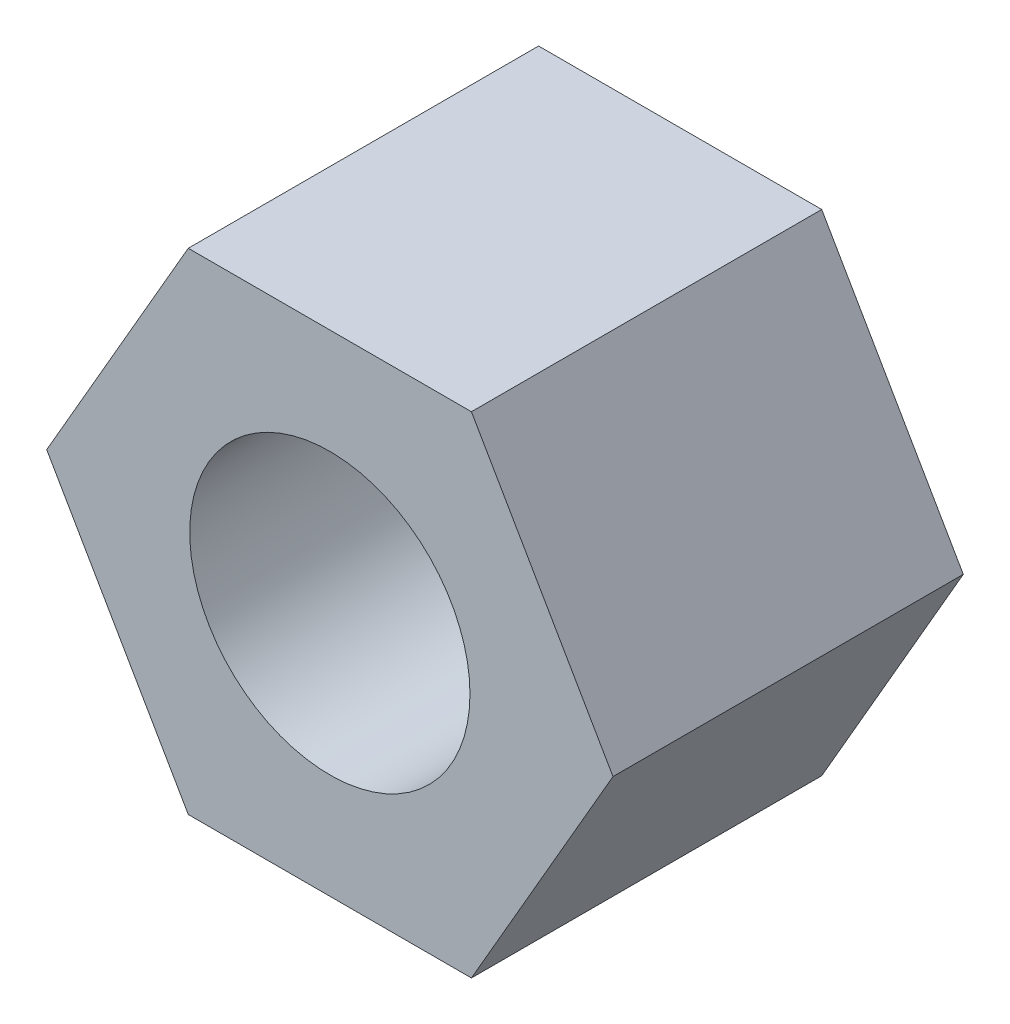
ISO-10303-21;
HEADER;
FILE_DESCRIPTION(('STEP AP214'),'2;1');
FILE_NAME('part.step','',(''),(''),'','','');
FILE_SCHEMA(('AUTOMOTIVE_DESIGN { 1 0 10303 214 1 1 1 1 }'));
ENDSEC;
DATA;
#1=APPLICATION_CONTEXT('core data for automotive mechanical design processes');
#2=APPLICATION_PROTOCOL_DEFINITION('international standard','automotive_design',2000,#1);
#3=PRODUCT_CONTEXT('',#1,'mechanical');
#4=PRODUCT('Part','Part','',(#3));
#5=PRODUCT_RELATED_PRODUCT_CATEGORY('part','',(#4));
#6=PRODUCT_DEFINITION_FORMATION('','',#4);
#7=PRODUCT_DEFINITION_CONTEXT('part definition',#1,'design');
#8=PRODUCT_DEFINITION('design','',#6,#7);
#9=PRODUCT_DEFINITION_SHAPE('','',#8);
#10=(LENGTH_UNIT() NAMED_UNIT(*) SI_UNIT(.MILLI.,.METRE.));
#11=(NAMED_UNIT(*) PLANE_ANGLE_UNIT() SI_UNIT($,.RADIAN.));
#12=(NAMED_UNIT(*) SI_UNIT($,.STERADIAN.) SOLID_ANGLE_UNIT());
#13=UNCERTAINTY_MEASURE_WITH_UNIT(LENGTH_MEASURE(1.E-05),#10,'distance_accuracy_value','');
#14=(GEOMETRIC_REPRESENTATION_CONTEXT(3) GLOBAL_UNCERTAINTY_ASSIGNED_CONTEXT((#13)) GLOBAL_UNIT_ASSIGNED_CONTEXT((#10,
#11,#12)) REPRESENTATION_CONTEXT('',''));
#15=CARTESIAN_POINT('',(0.,0.,0.));
#16=DIRECTION('',(0.,0.,1.));
#17=DIRECTION('',(1.,0.,0.));
#18=AXIS2_PLACEMENT_3D('',#15,#16,#17);
#19=CARTESIAN_POINT('',(-20.2072594216369,35.,50.));
#20=DIRECTION('',(0.866025403784439,-0.5,0.));
#21=DIRECTION('',(0.5,0.866025403784439,0.));
#22=AXIS2_PLACEMENT_3D('',#19,#20,#21);
#23=PLANE('',#22);
#24=DIRECTION('',(-0.5,-0.866025403784439,0.));
#25=VECTOR('',#24,1.);
#26=CARTESIAN_POINT('',(-20.2072594216369,35.,0.));
#27=LINE('',#26,#25);
#28=CARTESIAN_POINT('',(-20.2072594216369,35.,0.));
#29=VERTEX_POINT('',#28);
#30=CARTESIAN_POINT('',(-40.4145188432738,0.,0.));
#31=VERTEX_POINT('',#30);
#32=EDGE_CURVE('E117',#29,#31,#27,.T.);
#33=ORIENTED_EDGE('',*,*,#32,.T.);
#34=DIRECTION('',(0.,0.,-1.));
#35=VECTOR('',#34,1.);
#36=CARTESIAN_POINT('',(-40.4145188432738,0.,50.));
#37=LINE('',#36,#35);
#38=CARTESIAN_POINT('',(-40.4145188432738,0.,50.));
#39=VERTEX_POINT('',#38);
#40=EDGE_CURVE('E11',#39,#31,#37,.T.);
#41=ORIENTED_EDGE('',*,*,#40,.F.);
#42=DIRECTION('',(-0.5,-0.866025403784439,0.));
#43=VECTOR('',#42,1.);
#44=CARTESIAN_POINT('',(-20.2072594216369,35.,50.));
#45=LINE('',#44,#43);
#46=CARTESIAN_POINT('',(-20.2072594216369,35.,50.));
#47=VERTEX_POINT('',#46);
#48=EDGE_CURVE('E128',#47,#39,#45,.T.);
#49=ORIENTED_EDGE('',*,*,#48,.F.);
#50=DIRECTION('',(0.,0.,-1.));
#51=VECTOR('',#50,1.);
#52=CARTESIAN_POINT('',(-20.2072594216369,35.,50.));
#53=LINE('',#52,#51);
#54=EDGE_CURVE('E113',#47,#29,#53,.T.);
#55=ORIENTED_EDGE('',*,*,#54,.T.);
#56=EDGE_LOOP('',(#33,#41,#49,#55));
#57=FACE_BOUND('',#56,.T.);
#58=ADVANCED_FACE('F33',(#57),#23,.F.);
#59=CARTESIAN_POINT('',(-40.4145188432738,0.,50.));
#60=DIRECTION('',(0.866025403784438,0.5,0.));
#61=DIRECTION('',(-0.5,0.866025403784439,0.));
#62=AXIS2_PLACEMENT_3D('',#59,#60,#61);
#63=PLANE('',#62);
#64=DIRECTION('',(0.5,-0.866025403784438,0.));
#65=VECTOR('',#64,1.);
#66=CARTESIAN_POINT('',(-40.4145188432738,0.,0.));
#67=LINE('',#66,#65);
#68=CARTESIAN_POINT('',(-20.2072594216369,-35.,0.));
#69=VERTEX_POINT('',#68);
#70=EDGE_CURVE('E120',#31,#69,#67,.T.);
#71=ORIENTED_EDGE('',*,*,#70,.T.);
#72=DIRECTION('',(0.,0.,-1.));
#73=VECTOR('',#72,1.);
#74=CARTESIAN_POINT('',(-20.2072594216369,-35.,50.));
#75=LINE('',#74,#73);
#76=CARTESIAN_POINT('',(-20.2072594216369,-35.,50.));
#77=VERTEX_POINT('',#76);
#78=EDGE_CURVE('E41',#77,#69,#75,.T.);
#79=ORIENTED_EDGE('',*,*,#78,.F.);
#80=DIRECTION('',(0.5,-0.866025403784438,0.));
#81=VECTOR('',#80,1.);
#82=CARTESIAN_POINT('',(-40.4145188432738,0.,50.));
#83=LINE('',#82,#81);
#84=EDGE_CURVE('E86',#39,#77,#83,.T.);
#85=ORIENTED_EDGE('',*,*,#84,.F.);
#86=ORIENTED_EDGE('',*,*,#40,.T.);
#87=EDGE_LOOP('',(#71,#79,#85,#86));
#88=FACE_BOUND('',#87,.T.);
#89=ADVANCED_FACE('F153',(#88),#63,.F.);
#90=CARTESIAN_POINT('',(-20.2072594216369,-35.,50.));
#91=DIRECTION('',(0.,1.,0.));
#92=DIRECTION('',(-1.,0.,0.));
#93=AXIS2_PLACEMENT_3D('',#90,#91,#92);
#94=PLANE('',#93);
#95=DIRECTION('',(1.,0.,0.));
#96=VECTOR('',#95,1.);
#97=CARTESIAN_POINT('',(-20.2072594216369,-35.,0.));
#98=LINE('',#97,#96);
#99=CARTESIAN_POINT('',(20.2072594216369,-35.,0.));
#100=VERTEX_POINT('',#99);
#101=EDGE_CURVE('E123',#69,#100,#98,.T.);
#102=ORIENTED_EDGE('',*,*,#101,.T.);
#103=DIRECTION('',(0.,0.,-1.));
#104=VECTOR('',#103,1.);
#105=CARTESIAN_POINT('',(20.2072594216369,-35.,50.));
#106=LINE('',#105,#104);
#107=CARTESIAN_POINT('',(20.2072594216369,-35.,50.));
#108=VERTEX_POINT('',#107);
#109=EDGE_CURVE('E108',#108,#100,#106,.T.);
#110=ORIENTED_EDGE('',*,*,#109,.F.);
#111=DIRECTION('',(1.,0.,0.));
#112=VECTOR('',#111,1.);
#113=CARTESIAN_POINT('',(-20.2072594216369,-35.,50.));
#114=LINE('',#113,#112);
#115=EDGE_CURVE('E99',#77,#108,#114,.T.);
#116=ORIENTED_EDGE('',*,*,#115,.F.);
#117=ORIENTED_EDGE('',*,*,#78,.T.);
#118=EDGE_LOOP('',(#102,#110,#116,#117));
#119=FACE_BOUND('',#118,.T.);
#120=ADVANCED_FACE('F134',(#119),#94,.F.);
#121=CARTESIAN_POINT('',(20.2072594216369,-35.,50.));
#122=DIRECTION('',(-0.866025403784439,0.5,0.));
#123=DIRECTION('',(-0.5,-0.866025403784439,0.));
#124=AXIS2_PLACEMENT_3D('',#121,#122,#123);
#125=PLANE('',#124);
#126=DIRECTION('',(0.5,0.866025403784439,0.));
#127=VECTOR('',#126,1.);
#128=CARTESIAN_POINT('',(20.2072594216369,-35.,0.));
#129=LINE('',#128,#127);
#130=CARTESIAN_POINT('',(40.4145188432738,0.,0.));
#131=VERTEX_POINT('',#130);
#132=EDGE_CURVE('E107',#100,#131,#129,.T.);
#133=ORIENTED_EDGE('',*,*,#132,.T.);
#134=DIRECTION('',(0.,0.,-1.));
#135=VECTOR('',#134,1.);
#136=CARTESIAN_POINT('',(40.4145188432738,0.,50.));
#137=LINE('',#136,#135);
#138=CARTESIAN_POINT('',(40.4145188432738,0.,50.));
#139=VERTEX_POINT('',#138);
#140=EDGE_CURVE('E104',#139,#131,#137,.T.);
#141=ORIENTED_EDGE('',*,*,#140,.F.);
#142=DIRECTION('',(0.5,0.866025403784439,0.));
#143=VECTOR('',#142,1.);
#144=CARTESIAN_POINT('',(20.2072594216369,-35.,50.));
#145=LINE('',#144,#143);
#146=EDGE_CURVE('E93',#108,#139,#145,.T.);
#147=ORIENTED_EDGE('',*,*,#146,.F.);
#148=ORIENTED_EDGE('',*,*,#109,.T.);
#149=EDGE_LOOP('',(#133,#141,#147,#148));
#150=FACE_BOUND('',#149,.T.);
#151=ADVANCED_FACE('F105',(#150),#125,.F.);
#152=CARTESIAN_POINT('',(40.4145188432738,0.,50.));
#153=DIRECTION('',(-0.866025403784439,-0.5,0.));
#154=DIRECTION('',(0.5,-0.866025403784439,0.));
#155=AXIS2_PLACEMENT_3D('',#152,#153,#154);
#156=PLANE('',#155);
#157=DIRECTION('',(-0.5,0.866025403784439,0.));
#158=VECTOR('',#157,1.);
#159=CARTESIAN_POINT('',(40.4145188432738,0.,0.));
#160=LINE('',#159,#158);
#161=CARTESIAN_POINT('',(20.2072594216369,35.,0.));
#162=VERTEX_POINT('',#161);
#163=EDGE_CURVE('E72',#131,#162,#160,.T.);
#164=ORIENTED_EDGE('',*,*,#163,.T.);
#165=DIRECTION('',(0.,0.,-1.));
#166=VECTOR('',#165,1.);
#167=CARTESIAN_POINT('',(20.2072594216369,35.,50.));
#168=LINE('',#167,#166);
#169=CARTESIAN_POINT('',(20.2072594216369,35.,50.));
#170=VERTEX_POINT('',#169);
#171=EDGE_CURVE('E109',#170,#162,#168,.T.);
#172=ORIENTED_EDGE('',*,*,#171,.F.);
#173=DIRECTION('',(-0.5,0.866025403784439,0.));
#174=VECTOR('',#173,1.);
#175=CARTESIAN_POINT('',(40.4145188432738,0.,50.));
#176=LINE('',#175,#174);
#177=EDGE_CURVE('E97',#139,#170,#176,.T.);
#178=ORIENTED_EDGE('',*,*,#177,.F.);
#179=ORIENTED_EDGE('',*,*,#140,.T.);
#180=EDGE_LOOP('',(#164,#172,#178,#179));
#181=FACE_BOUND('',#180,.T.);
#182=ADVANCED_FACE('F111',(#181),#156,.F.);
#183=CARTESIAN_POINT('',(20.2072594216369,35.,50.));
#184=DIRECTION('',(0.,-1.,0.));
#185=DIRECTION('',(0.,0.,-1.));
#186=AXIS2_PLACEMENT_3D('',#183,#184,#185);
#187=PLANE('',#186);
#188=DIRECTION('',(-1.,0.,0.));
#189=VECTOR('',#188,1.);
#190=CARTESIAN_POINT('',(20.2072594216369,35.,0.));
#191=LINE('',#190,#189);
#192=EDGE_CURVE('E78',#162,#29,#191,.T.);
#193=ORIENTED_EDGE('',*,*,#192,.T.);
#194=ORIENTED_EDGE('',*,*,#54,.F.);
#195=DIRECTION('',(-1.,0.,0.));
#196=VECTOR('',#195,1.);
#197=CARTESIAN_POINT('',(20.2072594216369,35.,50.));
#198=LINE('',#197,#196);
#199=EDGE_CURVE('E49',#170,#47,#198,.T.);
#200=ORIENTED_EDGE('',*,*,#199,.F.);
#201=ORIENTED_EDGE('',*,*,#171,.T.);
#202=EDGE_LOOP('',(#193,#194,#200,#201));
#203=FACE_BOUND('',#202,.T.);
#204=ADVANCED_FACE('F141',(#203),#187,.F.);
#205=CARTESIAN_POINT('',(0.,0.,50.));
#206=DIRECTION('',(0.,0.,1.));
#207=DIRECTION('',(1.,0.,0.));
#208=AXIS2_PLACEMENT_3D('',#205,#206,#207);
#209=PLANE('',#208);
#210=CARTESIAN_POINT('',(0.,0.,50.));
#211=DIRECTION('',(0.,0.,1.));
#212=DIRECTION('',(1.,0.,0.));
#213=AXIS2_PLACEMENT_3D('',#210,#211,#212);
#214=CIRCLE('',#213,20.);
#215=CARTESIAN_POINT('',(20.,0.,50.));
#216=VERTEX_POINT('',#215);
#217=EDGE_CURVE('E208',#216,#216,#214,.T.);
#218=ORIENTED_EDGE('',*,*,#217,.F.);
#219=EDGE_LOOP('',(#218));
#220=FACE_BOUND('',#219,.T.);
#221=ORIENTED_EDGE('',*,*,#48,.T.);
#222=ORIENTED_EDGE('',*,*,#84,.T.);
#223=ORIENTED_EDGE('',*,*,#115,.T.);
#224=ORIENTED_EDGE('',*,*,#146,.T.);
#225=ORIENTED_EDGE('',*,*,#177,.T.);
#226=ORIENTED_EDGE('',*,*,#199,.T.);
#227=EDGE_LOOP('',(#221,#222,#223,#224,#225,#226));
#228=FACE_BOUND('',#227,.T.);
#229=ADVANCED_FACE('F95',(#220,#228),#209,.T.);
#230=CARTESIAN_POINT('',(0.,0.,0.));
#231=DIRECTION('',(0.,0.,1.));
#232=DIRECTION('',(1.,0.,0.));
#233=AXIS2_PLACEMENT_3D('',#230,#231,#232);
#234=PLANE('',#233);
#235=CARTESIAN_POINT('',(0.,0.,0.));
#236=DIRECTION('',(0.,0.,1.));
#237=DIRECTION('',(1.,0.,0.));
#238=AXIS2_PLACEMENT_3D('',#235,#236,#237);
#239=CIRCLE('',#238,20.);
#240=CARTESIAN_POINT('',(20.,0.,0.));
#241=VERTEX_POINT('',#240);
#242=EDGE_CURVE('E121',#241,#241,#239,.T.);
#243=ORIENTED_EDGE('',*,*,#242,.T.);
#244=EDGE_LOOP('',(#243));
#245=FACE_BOUND('',#244,.T.);
#246=ORIENTED_EDGE('',*,*,#32,.F.);
#247=ORIENTED_EDGE('',*,*,#192,.F.);
#248=ORIENTED_EDGE('',*,*,#163,.F.);
#249=ORIENTED_EDGE('',*,*,#132,.F.);
#250=ORIENTED_EDGE('',*,*,#101,.F.);
#251=ORIENTED_EDGE('',*,*,#70,.F.);
#252=EDGE_LOOP('',(#246,#247,#248,#249,#250,#251));
#253=FACE_BOUND('',#252,.T.);
#254=ADVANCED_FACE('F137',(#245,#253),#234,.F.);
#255=CARTESIAN_POINT('',(0.,0.,0.));
#256=DIRECTION('',(0.,0.,1.));
#257=DIRECTION('',(1.,0.,0.));
#258=AXIS2_PLACEMENT_3D('',#255,#256,#257);
#259=CYLINDRICAL_SURFACE('',#258,20.);
#260=ORIENTED_EDGE('',*,*,#242,.F.);
#261=EDGE_LOOP('',(#260));
#262=FACE_BOUND('',#261,.T.);
#263=ORIENTED_EDGE('',*,*,#217,.T.);
#264=EDGE_LOOP('',(#263));
#265=FACE_BOUND('',#264,.T.);
#266=ADVANCED_FACE('F190',(#262,#265),#259,.F.);
#267=CLOSED_SHELL('',(#58,#89,#120,#151,#182,#204,#229,#254,#266));
#268=MANIFOLD_SOLID_BREP('B2',#267);
#269=ADVANCED_BREP_SHAPE_REPRESENTATION('',(#18,#268),#14);
#270=SHAPE_DEFINITION_REPRESENTATION(#9,#269);
ENDSEC;
END-ISO-10303-21;
